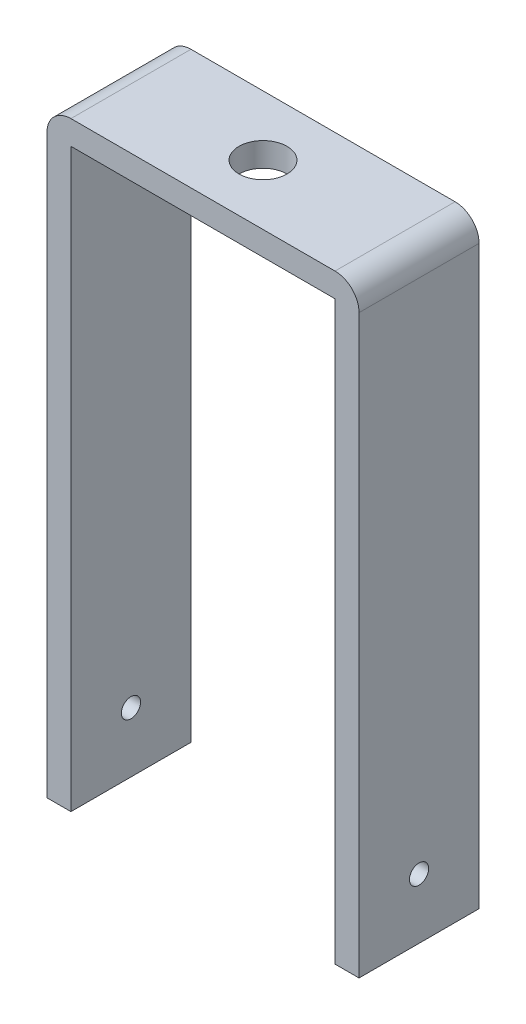
ISO-10303-21;
HEADER;
FILE_DESCRIPTION(('STEP AP214'),'2;1');
FILE_NAME('part.step','',(''),(''),'','','');
FILE_SCHEMA(('AUTOMOTIVE_DESIGN { 1 0 10303 214 1 1 1 1 }'));
ENDSEC;
DATA;
#1=APPLICATION_CONTEXT('core data for automotive mechanical design processes');
#2=APPLICATION_PROTOCOL_DEFINITION('international standard','automotive_design',2000,#1);
#3=PRODUCT_CONTEXT('',#1,'mechanical');
#4=PRODUCT('Part','Part','',(#3));
#5=PRODUCT_RELATED_PRODUCT_CATEGORY('part','',(#4));
#6=PRODUCT_DEFINITION_FORMATION('','',#4);
#7=PRODUCT_DEFINITION_CONTEXT('part definition',#1,'design');
#8=PRODUCT_DEFINITION('design','',#6,#7);
#9=PRODUCT_DEFINITION_SHAPE('','',#8);
#10=(LENGTH_UNIT() NAMED_UNIT(*) SI_UNIT(.MILLI.,.METRE.));
#11=(NAMED_UNIT(*) PLANE_ANGLE_UNIT() SI_UNIT($,.RADIAN.));
#12=(NAMED_UNIT(*) SI_UNIT($,.STERADIAN.) SOLID_ANGLE_UNIT());
#13=UNCERTAINTY_MEASURE_WITH_UNIT(LENGTH_MEASURE(1.E-05),#10,'distance_accuracy_value','');
#14=(GEOMETRIC_REPRESENTATION_CONTEXT(3) GLOBAL_UNCERTAINTY_ASSIGNED_CONTEXT((#13)) GLOBAL_UNIT_ASSIGNED_CONTEXT((#10,
#11,#12)) REPRESENTATION_CONTEXT('',''));
#15=CARTESIAN_POINT('',(0.,0.,0.));
#16=DIRECTION('',(0.,0.,1.));
#17=DIRECTION('',(1.,0.,0.));
#18=AXIS2_PLACEMENT_3D('',#15,#16,#17);
#19=CARTESIAN_POINT('',(0.,-10.,50.));
#20=DIRECTION('',(0.,1.,0.));
#21=DIRECTION('',(0.,0.,1.));
#22=AXIS2_PLACEMENT_3D('',#19,#20,#21);
#23=PLANE('',#22);
#24=CARTESIAN_POINT('',(65.,-10.,25.));
#25=DIRECTION('',(0.,1.,0.));
#26=DIRECTION('',(0.,0.,1.));
#27=AXIS2_PLACEMENT_3D('',#24,#25,#26);
#28=CIRCLE('',#27,9.99999999999999);
#29=CARTESIAN_POINT('',(65.,-10.,35.));
#30=VERTEX_POINT('',#29);
#31=EDGE_CURVE('E223',#30,#30,#28,.T.);
#32=ORIENTED_EDGE('',*,*,#31,.T.);
#33=EDGE_LOOP('',(#32));
#34=FACE_BOUND('',#33,.T.);
#35=DIRECTION('',(1.,0.,0.));
#36=VECTOR('',#35,1.);
#37=CARTESIAN_POINT('',(0.,-10.,0.));
#38=LINE('',#37,#36);
#39=CARTESIAN_POINT('',(10.,-10.,0.));
#40=VERTEX_POINT('',#39);
#41=CARTESIAN_POINT('',(120.,-10.,0.));
#42=VERTEX_POINT('',#41);
#43=EDGE_CURVE('E135',#40,#42,#38,.T.);
#44=ORIENTED_EDGE('',*,*,#43,.T.);
#45=DIRECTION('',(0.,0.,-1.));
#46=VECTOR('',#45,1.);
#47=CARTESIAN_POINT('',(120.,-10.,50.));
#48=LINE('',#47,#46);
#49=CARTESIAN_POINT('',(120.,-10.,50.));
#50=VERTEX_POINT('',#49);
#51=EDGE_CURVE('E117',#50,#42,#48,.T.);
#52=ORIENTED_EDGE('',*,*,#51,.F.);
#53=DIRECTION('',(1.,0.,0.));
#54=VECTOR('',#53,1.);
#55=CARTESIAN_POINT('',(0.,-10.,50.));
#56=LINE('',#55,#54);
#57=CARTESIAN_POINT('',(10.,-10.,50.));
#58=VERTEX_POINT('',#57);
#59=EDGE_CURVE('E124',#58,#50,#56,.T.);
#60=ORIENTED_EDGE('',*,*,#59,.F.);
#61=DIRECTION('',(0.,0.,-1.));
#62=VECTOR('',#61,1.);
#63=CARTESIAN_POINT('',(10.,-10.,50.));
#64=LINE('',#63,#62);
#65=EDGE_CURVE('E193',#58,#40,#64,.T.);
#66=ORIENTED_EDGE('',*,*,#65,.T.);
#67=EDGE_LOOP('',(#44,#52,#60,#66));
#68=FACE_BOUND('',#67,.T.);
#69=ADVANCED_FACE('F35',(#34,#68),#23,.F.);
#70=CARTESIAN_POINT('',(120.,0.,50.));
#71=DIRECTION('',(1.,0.,0.));
#72=DIRECTION('',(0.,0.,-1.));
#73=AXIS2_PLACEMENT_3D('',#70,#71,#72);
#74=PLANE('',#73);
#75=CARTESIAN_POINT('',(120.,-225.,25.));
#76=DIRECTION('',(1.,0.,0.));
#77=DIRECTION('',(0.,0.,-1.));
#78=AXIS2_PLACEMENT_3D('',#75,#76,#77);
#79=CIRCLE('',#78,4.);
#80=CARTESIAN_POINT('',(120.,-225.,21.));
#81=VERTEX_POINT('',#80);
#82=EDGE_CURVE('E209',#81,#81,#79,.T.);
#83=ORIENTED_EDGE('',*,*,#82,.T.);
#84=EDGE_LOOP('',(#83));
#85=FACE_BOUND('',#84,.T.);
#86=DIRECTION('',(0.,-1.,0.));
#87=VECTOR('',#86,1.);
#88=CARTESIAN_POINT('',(120.,0.,0.));
#89=LINE('',#88,#87);
#90=CARTESIAN_POINT('',(120.,-250.,0.));
#91=VERTEX_POINT('',#90);
#92=EDGE_CURVE('E205',#42,#91,#89,.T.);
#93=ORIENTED_EDGE('',*,*,#92,.T.);
#94=DIRECTION('',(0.,0.,-1.));
#95=VECTOR('',#94,1.);
#96=CARTESIAN_POINT('',(120.,-250.,50.));
#97=LINE('',#96,#95);
#98=CARTESIAN_POINT('',(120.,-250.,50.));
#99=VERTEX_POINT('',#98);
#100=EDGE_CURVE('E120',#99,#91,#97,.T.);
#101=ORIENTED_EDGE('',*,*,#100,.F.);
#102=DIRECTION('',(0.,-1.,0.));
#103=VECTOR('',#102,1.);
#104=CARTESIAN_POINT('',(120.,0.,50.));
#105=LINE('',#104,#103);
#106=EDGE_CURVE('E113',#50,#99,#105,.T.);
#107=ORIENTED_EDGE('',*,*,#106,.F.);
#108=ORIENTED_EDGE('',*,*,#51,.T.);
#109=EDGE_LOOP('',(#93,#101,#107,#108));
#110=FACE_BOUND('',#109,.T.);
#111=ADVANCED_FACE('F115',(#85,#110),#74,.F.);
#112=CARTESIAN_POINT('',(0.,-250.,50.));
#113=DIRECTION('',(0.,1.,0.));
#114=DIRECTION('',(0.,0.,1.));
#115=AXIS2_PLACEMENT_3D('',#112,#113,#114);
#116=PLANE('',#115);
#117=DIRECTION('',(1.,0.,0.));
#118=VECTOR('',#117,1.);
#119=CARTESIAN_POINT('',(0.,-250.,0.));
#120=LINE('',#119,#118);
#121=CARTESIAN_POINT('',(130.,-250.,0.));
#122=VERTEX_POINT('',#121);
#123=EDGE_CURVE('E185',#91,#122,#120,.T.);
#124=ORIENTED_EDGE('',*,*,#123,.T.);
#125=DIRECTION('',(0.,0.,-1.));
#126=VECTOR('',#125,1.);
#127=CARTESIAN_POINT('',(130.,-250.,50.));
#128=LINE('',#127,#126);
#129=CARTESIAN_POINT('',(130.,-250.,50.));
#130=VERTEX_POINT('',#129);
#131=EDGE_CURVE('E141',#130,#122,#128,.T.);
#132=ORIENTED_EDGE('',*,*,#131,.F.);
#133=DIRECTION('',(1.,0.,0.));
#134=VECTOR('',#133,1.);
#135=CARTESIAN_POINT('',(0.,-250.,50.));
#136=LINE('',#135,#134);
#137=EDGE_CURVE('E123',#99,#130,#136,.T.);
#138=ORIENTED_EDGE('',*,*,#137,.F.);
#139=ORIENTED_EDGE('',*,*,#100,.T.);
#140=EDGE_LOOP('',(#124,#132,#138,#139));
#141=FACE_BOUND('',#140,.T.);
#142=ADVANCED_FACE('F204',(#141),#116,.F.);
#143=CARTESIAN_POINT('',(130.,0.,50.));
#144=DIRECTION('',(1.,0.,0.));
#145=DIRECTION('',(0.,1.,0.));
#146=AXIS2_PLACEMENT_3D('',#143,#144,#145);
#147=PLANE('',#146);
#148=CARTESIAN_POINT('',(130.,-225.,25.));
#149=DIRECTION('',(1.,0.,0.));
#150=DIRECTION('',(0.,1.,0.));
#151=AXIS2_PLACEMENT_3D('',#148,#149,#150);
#152=CIRCLE('',#151,4.);
#153=CARTESIAN_POINT('',(130.,-221.,25.));
#154=VERTEX_POINT('',#153);
#155=EDGE_CURVE('E220',#154,#154,#152,.T.);
#156=ORIENTED_EDGE('',*,*,#155,.F.);
#157=EDGE_LOOP('',(#156));
#158=FACE_BOUND('',#157,.T.);
#159=DIRECTION('',(0.,-1.,0.));
#160=VECTOR('',#159,1.);
#161=CARTESIAN_POINT('',(130.,0.,0.));
#162=LINE('',#161,#160);
#163=CARTESIAN_POINT('',(130.,-10.,0.));
#164=VERTEX_POINT('',#163);
#165=EDGE_CURVE('E181',#164,#122,#162,.T.);
#166=ORIENTED_EDGE('',*,*,#165,.F.);
#167=DIRECTION('',(0.,0.,-1.));
#168=VECTOR('',#167,1.);
#169=CARTESIAN_POINT('',(130.,-10.,50.));
#170=LINE('',#169,#168);
#171=CARTESIAN_POINT('',(130.,-10.,50.));
#172=VERTEX_POINT('',#171);
#173=EDGE_CURVE('E11',#164,#172,#170,.F.);
#174=ORIENTED_EDGE('',*,*,#173,.T.);
#175=DIRECTION('',(0.,-1.,0.));
#176=VECTOR('',#175,1.);
#177=CARTESIAN_POINT('',(130.,0.,50.));
#178=LINE('',#177,#176);
#179=EDGE_CURVE('E201',#172,#130,#178,.T.);
#180=ORIENTED_EDGE('',*,*,#179,.T.);
#181=ORIENTED_EDGE('',*,*,#131,.T.);
#182=EDGE_LOOP('',(#166,#174,#180,#181));
#183=FACE_BOUND('',#182,.T.);
#184=ADVANCED_FACE('F200',(#158,#183),#147,.T.);
#185=CARTESIAN_POINT('',(0.,0.,50.));
#186=DIRECTION('',(0.,1.,0.));
#187=DIRECTION('',(0.,0.,1.));
#188=AXIS2_PLACEMENT_3D('',#185,#186,#187);
#189=PLANE('',#188);
#190=CARTESIAN_POINT('',(65.,0.,25.));
#191=DIRECTION('',(0.,1.,0.));
#192=DIRECTION('',(0.,0.,1.));
#193=AXIS2_PLACEMENT_3D('',#190,#191,#192);
#194=CIRCLE('',#193,9.99999999999999);
#195=CARTESIAN_POINT('',(65.,0.,35.));
#196=VERTEX_POINT('',#195);
#197=EDGE_CURVE('E224',#196,#196,#194,.T.);
#198=ORIENTED_EDGE('',*,*,#197,.F.);
#199=EDGE_LOOP('',(#198));
#200=FACE_BOUND('',#199,.T.);
#201=DIRECTION('',(1.,0.,0.));
#202=VECTOR('',#201,1.);
#203=CARTESIAN_POINT('',(0.,0.,0.));
#204=LINE('',#203,#202);
#205=CARTESIAN_POINT('',(10.,0.,0.));
#206=VERTEX_POINT('',#205);
#207=CARTESIAN_POINT('',(120.,0.,0.));
#208=VERTEX_POINT('',#207);
#209=EDGE_CURVE('E175',#206,#208,#204,.T.);
#210=ORIENTED_EDGE('',*,*,#209,.F.);
#211=DIRECTION('',(0.,0.,-1.));
#212=VECTOR('',#211,1.);
#213=CARTESIAN_POINT('',(10.,0.,50.));
#214=LINE('',#213,#212);
#215=CARTESIAN_POINT('',(10.,0.,50.));
#216=VERTEX_POINT('',#215);
#217=EDGE_CURVE('E151',#206,#216,#214,.F.);
#218=ORIENTED_EDGE('',*,*,#217,.T.);
#219=DIRECTION('',(1.,0.,0.));
#220=VECTOR('',#219,1.);
#221=CARTESIAN_POINT('',(0.,0.,50.));
#222=LINE('',#221,#220);
#223=CARTESIAN_POINT('',(120.,0.,50.));
#224=VERTEX_POINT('',#223);
#225=EDGE_CURVE('E158',#216,#224,#222,.T.);
#226=ORIENTED_EDGE('',*,*,#225,.T.);
#227=DIRECTION('',(0.,0.,-1.));
#228=VECTOR('',#227,1.);
#229=CARTESIAN_POINT('',(120.,0.,50.));
#230=LINE('',#229,#228);
#231=EDGE_CURVE('E148',#224,#208,#230,.T.);
#232=ORIENTED_EDGE('',*,*,#231,.T.);
#233=EDGE_LOOP('',(#210,#218,#226,#232));
#234=FACE_BOUND('',#233,.T.);
#235=ADVANCED_FACE('F179',(#200,#234),#189,.T.);
#236=CARTESIAN_POINT('',(0.,0.,50.));
#237=DIRECTION('',(1.,0.,0.));
#238=DIRECTION('',(0.,1.,0.));
#239=AXIS2_PLACEMENT_3D('',#236,#237,#238);
#240=PLANE('',#239);
#241=CARTESIAN_POINT('',(0.,-225.,25.));
#242=DIRECTION('',(1.,0.,0.));
#243=DIRECTION('',(0.,1.,0.));
#244=AXIS2_PLACEMENT_3D('',#241,#242,#243);
#245=CIRCLE('',#244,4.);
#246=CARTESIAN_POINT('',(0.,-221.,25.));
#247=VERTEX_POINT('',#246);
#248=EDGE_CURVE('E217',#247,#247,#245,.T.);
#249=ORIENTED_EDGE('',*,*,#248,.T.);
#250=EDGE_LOOP('',(#249));
#251=FACE_BOUND('',#250,.T.);
#252=DIRECTION('',(0.,-1.,0.));
#253=VECTOR('',#252,1.);
#254=CARTESIAN_POINT('',(0.,0.,50.));
#255=LINE('',#254,#253);
#256=CARTESIAN_POINT('',(0.,-10.,50.));
#257=VERTEX_POINT('',#256);
#258=CARTESIAN_POINT('',(0.,-250.,50.));
#259=VERTEX_POINT('',#258);
#260=EDGE_CURVE('E156',#257,#259,#255,.T.);
#261=ORIENTED_EDGE('',*,*,#260,.F.);
#262=DIRECTION('',(0.,0.,-1.));
#263=VECTOR('',#262,1.);
#264=CARTESIAN_POINT('',(0.,-10.,0.));
#265=LINE('',#264,#263);
#266=CARTESIAN_POINT('',(0.,-10.,0.));
#267=VERTEX_POINT('',#266);
#268=EDGE_CURVE('E136',#257,#267,#265,.T.);
#269=ORIENTED_EDGE('',*,*,#268,.T.);
#270=DIRECTION('',(0.,-1.,0.));
#271=VECTOR('',#270,1.);
#272=CARTESIAN_POINT('',(0.,0.,0.));
#273=LINE('',#272,#271);
#274=CARTESIAN_POINT('',(0.,-250.,0.));
#275=VERTEX_POINT('',#274);
#276=EDGE_CURVE('E177',#267,#275,#273,.T.);
#277=ORIENTED_EDGE('',*,*,#276,.T.);
#278=DIRECTION('',(0.,0.,-1.));
#279=VECTOR('',#278,1.);
#280=CARTESIAN_POINT('',(0.,-250.,50.));
#281=LINE('',#280,#279);
#282=EDGE_CURVE('E166',#259,#275,#281,.T.);
#283=ORIENTED_EDGE('',*,*,#282,.F.);
#284=EDGE_LOOP('',(#261,#269,#277,#283));
#285=FACE_BOUND('',#284,.T.);
#286=ADVANCED_FACE('F163',(#251,#285),#240,.F.);
#287=CARTESIAN_POINT('',(0.,-250.,50.));
#288=DIRECTION('',(0.,1.,0.));
#289=DIRECTION('',(0.,0.,1.));
#290=AXIS2_PLACEMENT_3D('',#287,#288,#289);
#291=PLANE('',#290);
#292=DIRECTION('',(1.,0.,0.));
#293=VECTOR('',#292,1.);
#294=CARTESIAN_POINT('',(0.,-250.,0.));
#295=LINE('',#294,#293);
#296=CARTESIAN_POINT('',(10.,-250.,0.));
#297=VERTEX_POINT('',#296);
#298=EDGE_CURVE('E183',#275,#297,#295,.T.);
#299=ORIENTED_EDGE('',*,*,#298,.T.);
#300=DIRECTION('',(0.,0.,-1.));
#301=VECTOR('',#300,1.);
#302=CARTESIAN_POINT('',(10.,-250.,50.));
#303=LINE('',#302,#301);
#304=CARTESIAN_POINT('',(10.,-250.,50.));
#305=VERTEX_POINT('',#304);
#306=EDGE_CURVE('E195',#305,#297,#303,.T.);
#307=ORIENTED_EDGE('',*,*,#306,.F.);
#308=DIRECTION('',(1.,0.,0.));
#309=VECTOR('',#308,1.);
#310=CARTESIAN_POINT('',(0.,-250.,50.));
#311=LINE('',#310,#309);
#312=EDGE_CURVE('E168',#259,#305,#311,.T.);
#313=ORIENTED_EDGE('',*,*,#312,.F.);
#314=ORIENTED_EDGE('',*,*,#282,.T.);
#315=EDGE_LOOP('',(#299,#307,#313,#314));
#316=FACE_BOUND('',#315,.T.);
#317=ADVANCED_FACE('F244',(#316),#291,.F.);
#318=CARTESIAN_POINT('',(10.,0.,50.));
#319=DIRECTION('',(1.,0.,0.));
#320=DIRECTION('',(0.,1.,0.));
#321=AXIS2_PLACEMENT_3D('',#318,#319,#320);
#322=PLANE('',#321);
#323=CARTESIAN_POINT('',(10.,-225.,25.));
#324=DIRECTION('',(1.,0.,0.));
#325=DIRECTION('',(0.,1.,0.));
#326=AXIS2_PLACEMENT_3D('',#323,#324,#325);
#327=CIRCLE('',#326,4.);
#328=CARTESIAN_POINT('',(10.,-221.,25.));
#329=VERTEX_POINT('',#328);
#330=EDGE_CURVE('E39',#329,#329,#327,.T.);
#331=ORIENTED_EDGE('',*,*,#330,.F.);
#332=EDGE_LOOP('',(#331));
#333=FACE_BOUND('',#332,.T.);
#334=DIRECTION('',(0.,-1.,0.));
#335=VECTOR('',#334,1.);
#336=CARTESIAN_POINT('',(10.,0.,0.));
#337=LINE('',#336,#335);
#338=EDGE_CURVE('E132',#40,#297,#337,.T.);
#339=ORIENTED_EDGE('',*,*,#338,.F.);
#340=ORIENTED_EDGE('',*,*,#65,.F.);
#341=DIRECTION('',(0.,-1.,0.));
#342=VECTOR('',#341,1.);
#343=CARTESIAN_POINT('',(10.,0.,50.));
#344=LINE('',#343,#342);
#345=EDGE_CURVE('E130',#58,#305,#344,.T.);
#346=ORIENTED_EDGE('',*,*,#345,.T.);
#347=ORIENTED_EDGE('',*,*,#306,.T.);
#348=EDGE_LOOP('',(#339,#340,#346,#347));
#349=FACE_BOUND('',#348,.T.);
#350=ADVANCED_FACE('F268',(#333,#349),#322,.T.);
#351=CARTESIAN_POINT('',(0.,0.,50.));
#352=DIRECTION('',(0.,0.,1.));
#353=DIRECTION('',(1.,0.,0.));
#354=AXIS2_PLACEMENT_3D('',#351,#352,#353);
#355=PLANE('',#354);
#356=ORIENTED_EDGE('',*,*,#225,.F.);
#357=CARTESIAN_POINT('',(10.,-10.,50.));
#358=DIRECTION('',(0.,0.,1.));
#359=DIRECTION('',(1.,0.,0.));
#360=AXIS2_PLACEMENT_3D('',#357,#358,#359);
#361=CIRCLE('',#360,10.);
#362=EDGE_CURVE('E44',#216,#257,#361,.T.);
#363=ORIENTED_EDGE('',*,*,#362,.T.);
#364=ORIENTED_EDGE('',*,*,#260,.T.);
#365=ORIENTED_EDGE('',*,*,#312,.T.);
#366=ORIENTED_EDGE('',*,*,#345,.F.);
#367=ORIENTED_EDGE('',*,*,#59,.T.);
#368=ORIENTED_EDGE('',*,*,#106,.T.);
#369=ORIENTED_EDGE('',*,*,#137,.T.);
#370=ORIENTED_EDGE('',*,*,#179,.F.);
#371=CARTESIAN_POINT('',(120.,-10.,50.));
#372=DIRECTION('',(0.,0.,1.));
#373=DIRECTION('',(1.,0.,0.));
#374=AXIS2_PLACEMENT_3D('',#371,#372,#373);
#375=CIRCLE('',#374,10.);
#376=EDGE_CURVE('E56',#172,#224,#375,.T.);
#377=ORIENTED_EDGE('',*,*,#376,.T.);
#378=EDGE_LOOP('',(#356,#363,#364,#365,#366,#367,#368,#369,#370,#377));
#379=FACE_BOUND('',#378,.T.);
#380=ADVANCED_FACE('F128',(#379),#355,.T.);
#381=CARTESIAN_POINT('',(0.,0.,0.));
#382=DIRECTION('',(0.,0.,1.));
#383=DIRECTION('',(1.,0.,0.));
#384=AXIS2_PLACEMENT_3D('',#381,#382,#383);
#385=PLANE('',#384);
#386=ORIENTED_EDGE('',*,*,#276,.F.);
#387=CARTESIAN_POINT('',(10.,-10.,0.));
#388=DIRECTION('',(0.,0.,1.));
#389=DIRECTION('',(1.,0.,0.));
#390=AXIS2_PLACEMENT_3D('',#387,#388,#389);
#391=CIRCLE('',#390,10.);
#392=EDGE_CURVE('E146',#267,#206,#391,.F.);
#393=ORIENTED_EDGE('',*,*,#392,.T.);
#394=ORIENTED_EDGE('',*,*,#209,.T.);
#395=CARTESIAN_POINT('',(120.,-10.,0.));
#396=DIRECTION('',(0.,0.,1.));
#397=DIRECTION('',(1.,0.,0.));
#398=AXIS2_PLACEMENT_3D('',#395,#396,#397);
#399=CIRCLE('',#398,10.);
#400=EDGE_CURVE('E139',#208,#164,#399,.F.);
#401=ORIENTED_EDGE('',*,*,#400,.T.);
#402=ORIENTED_EDGE('',*,*,#165,.T.);
#403=ORIENTED_EDGE('',*,*,#123,.F.);
#404=ORIENTED_EDGE('',*,*,#92,.F.);
#405=ORIENTED_EDGE('',*,*,#43,.F.);
#406=ORIENTED_EDGE('',*,*,#338,.T.);
#407=ORIENTED_EDGE('',*,*,#298,.F.);
#408=EDGE_LOOP('',(#386,#393,#394,#401,#402,#403,#404,#405,#406,#407));
#409=FACE_BOUND('',#408,.T.);
#410=ADVANCED_FACE('F174',(#409),#385,.F.);
#411=CARTESIAN_POINT('',(10.,-10.,50.));
#412=DIRECTION('',(0.,0.,1.));
#413=DIRECTION('',(1.,0.,0.));
#414=AXIS2_PLACEMENT_3D('',#411,#412,#413);
#415=CYLINDRICAL_SURFACE('',#414,10.);
#416=ORIENTED_EDGE('',*,*,#362,.F.);
#417=ORIENTED_EDGE('',*,*,#217,.F.);
#418=ORIENTED_EDGE('',*,*,#392,.F.);
#419=ORIENTED_EDGE('',*,*,#268,.F.);
#420=EDGE_LOOP('',(#416,#417,#418,#419));
#421=FACE_BOUND('',#420,.T.);
#422=ADVANCED_FACE('F170',(#421),#415,.T.);
#423=CARTESIAN_POINT('',(120.,-10.,50.));
#424=DIRECTION('',(0.,0.,-1.));
#425=DIRECTION('',(-1.,0.,0.));
#426=AXIS2_PLACEMENT_3D('',#423,#424,#425);
#427=CYLINDRICAL_SURFACE('',#426,10.);
#428=ORIENTED_EDGE('',*,*,#376,.F.);
#429=ORIENTED_EDGE('',*,*,#173,.F.);
#430=ORIENTED_EDGE('',*,*,#400,.F.);
#431=ORIENTED_EDGE('',*,*,#231,.F.);
#432=EDGE_LOOP('',(#428,#429,#430,#431));
#433=FACE_BOUND('',#432,.T.);
#434=ADVANCED_FACE('F37',(#433),#427,.T.);
#435=CARTESIAN_POINT('',(-19.,-225.,25.));
#436=DIRECTION('',(1.,0.,0.));
#437=DIRECTION('',(0.,1.,0.));
#438=AXIS2_PLACEMENT_3D('',#435,#436,#437);
#439=CYLINDRICAL_SURFACE('',#438,4.);
#440=ORIENTED_EDGE('',*,*,#330,.T.);
#441=EDGE_LOOP('',(#440));
#442=FACE_BOUND('',#441,.T.);
#443=ORIENTED_EDGE('',*,*,#248,.F.);
#444=EDGE_LOOP('',(#443));
#445=FACE_BOUND('',#444,.T.);
#446=ADVANCED_FACE('F262',(#442,#445),#439,.F.);
#447=ORIENTED_EDGE('',*,*,#155,.T.);
#448=EDGE_LOOP('',(#447));
#449=FACE_BOUND('',#448,.T.);
#450=ORIENTED_EDGE('',*,*,#82,.F.);
#451=EDGE_LOOP('',(#450));
#452=FACE_BOUND('',#451,.T.);
#453=ADVANCED_FACE('F234',(#449,#452),#439,.F.);
#454=CARTESIAN_POINT('',(65.,-10.,25.));
#455=DIRECTION('',(0.,1.,0.));
#456=DIRECTION('',(0.,0.,1.));
#457=AXIS2_PLACEMENT_3D('',#454,#455,#456);
#458=CYLINDRICAL_SURFACE('',#457,9.99999999999999);
#459=ORIENTED_EDGE('',*,*,#31,.F.);
#460=EDGE_LOOP('',(#459));
#461=FACE_BOUND('',#460,.T.);
#462=ORIENTED_EDGE('',*,*,#197,.T.);
#463=EDGE_LOOP('',(#462));
#464=FACE_BOUND('',#463,.T.);
#465=ADVANCED_FACE('F231',(#461,#464),#458,.F.);
#466=CLOSED_SHELL('',(#69,#111,#142,#184,#235,#286,#317,#350,#380,#410,#422,#434,#446,#453,#465));
#467=MANIFOLD_SOLID_BREP('B2',#466);
#468=ADVANCED_BREP_SHAPE_REPRESENTATION('',(#18,#467),#14);
#469=SHAPE_DEFINITION_REPRESENTATION(#9,#468);
ENDSEC;
END-ISO-10303-21;
